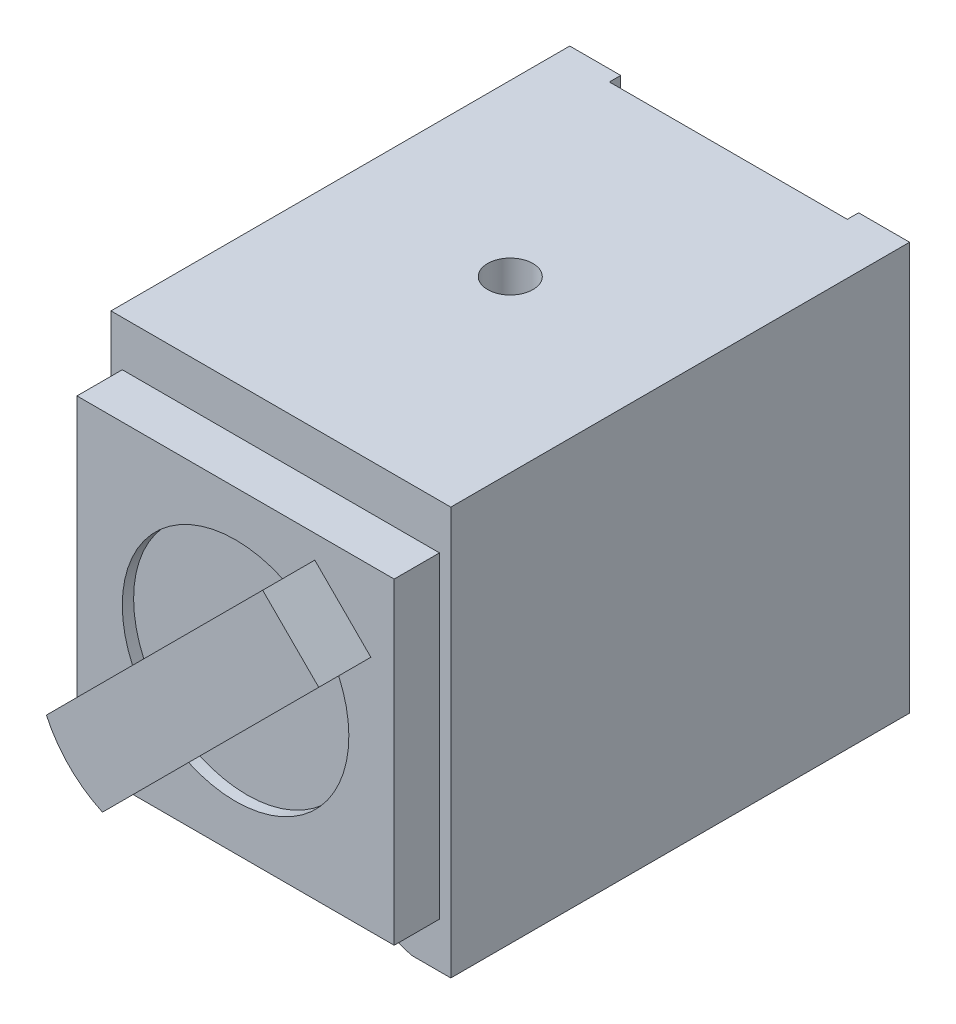
ISO-10303-21;
HEADER;
FILE_DESCRIPTION(('STEP AP214'),'2;1');
FILE_NAME('part.step','',(''),(''),'','','');
FILE_SCHEMA(('AUTOMOTIVE_DESIGN { 1 0 10303 214 1 1 1 1 }'));
ENDSEC;
DATA;
#1=APPLICATION_CONTEXT('core data for automotive mechanical design processes');
#2=APPLICATION_PROTOCOL_DEFINITION('international standard','automotive_design',2000,#1);
#3=PRODUCT_CONTEXT('',#1,'mechanical');
#4=PRODUCT('Part','Part','',(#3));
#5=PRODUCT_RELATED_PRODUCT_CATEGORY('part','',(#4));
#6=PRODUCT_DEFINITION_FORMATION('','',#4);
#7=PRODUCT_DEFINITION_CONTEXT('part definition',#1,'design');
#8=PRODUCT_DEFINITION('design','',#6,#7);
#9=PRODUCT_DEFINITION_SHAPE('','',#8);
#10=(LENGTH_UNIT() NAMED_UNIT(*) SI_UNIT(.MILLI.,.METRE.));
#11=(NAMED_UNIT(*) PLANE_ANGLE_UNIT() SI_UNIT($,.RADIAN.));
#12=(NAMED_UNIT(*) SI_UNIT($,.STERADIAN.) SOLID_ANGLE_UNIT());
#13=UNCERTAINTY_MEASURE_WITH_UNIT(LENGTH_MEASURE(1.E-05),#10,'distance_accuracy_value','');
#14=(GEOMETRIC_REPRESENTATION_CONTEXT(3) GLOBAL_UNCERTAINTY_ASSIGNED_CONTEXT((#13)) GLOBAL_UNIT_ASSIGNED_CONTEXT((#10,
#11,#12)) REPRESENTATION_CONTEXT('',''));
#15=CARTESIAN_POINT('',(0.,0.,0.));
#16=DIRECTION('',(0.,0.,1.));
#17=DIRECTION('',(1.,0.,0.));
#18=AXIS2_PLACEMENT_3D('',#15,#16,#17);
#19=CARTESIAN_POINT('',(0.,0.,0.));
#20=DIRECTION('',(0.,1.,0.));
#21=DIRECTION('',(0.,0.,1.));
#22=AXIS2_PLACEMENT_3D('',#19,#20,#21);
#23=PLANE('',#22);
#24=DIRECTION('',(-1.,0.,0.));
#25=VECTOR('',#24,1.);
#26=CARTESIAN_POINT('',(-15.,0.,-20.25));
#27=LINE('',#26,#25);
#28=CARTESIAN_POINT('',(-11.5,0.,-20.25));
#29=VERTEX_POINT('',#28);
#30=CARTESIAN_POINT('',(-15.,0.,-20.25));
#31=VERTEX_POINT('',#30);
#32=EDGE_CURVE('E232',#29,#31,#27,.T.);
#33=ORIENTED_EDGE('',*,*,#32,.F.);
#34=DIRECTION('',(0.,0.,1.));
#35=VECTOR('',#34,1.);
#36=CARTESIAN_POINT('',(-11.5,0.,-20.25));
#37=LINE('',#36,#35);
#38=CARTESIAN_POINT('',(-11.5,0.,20.25));
#39=VERTEX_POINT('',#38);
#40=EDGE_CURVE('E268',#29,#39,#37,.T.);
#41=ORIENTED_EDGE('',*,*,#40,.T.);
#42=DIRECTION('',(1.,0.,0.));
#43=VECTOR('',#42,1.);
#44=CARTESIAN_POINT('',(-15.,0.,20.25));
#45=LINE('',#44,#43);
#46=CARTESIAN_POINT('',(-15.,0.,20.25));
#47=VERTEX_POINT('',#46);
#48=EDGE_CURVE('E392',#47,#39,#45,.T.);
#49=ORIENTED_EDGE('',*,*,#48,.F.);
#50=DIRECTION('',(0.,0.,1.));
#51=VECTOR('',#50,1.);
#52=CARTESIAN_POINT('',(-15.,0.,-20.25));
#53=LINE('',#52,#51);
#54=EDGE_CURVE('E383',#31,#47,#53,.T.);
#55=ORIENTED_EDGE('',*,*,#54,.F.);
#56=EDGE_LOOP('',(#33,#41,#49,#55));
#57=FACE_BOUND('',#56,.T.);
#58=ADVANCED_FACE('F45',(#57),#23,.F.);
#59=CARTESIAN_POINT('',(-15.,36.,-20.25));
#60=DIRECTION('',(0.,0.,1.));
#61=DIRECTION('',(1.,0.,0.));
#62=AXIS2_PLACEMENT_3D('',#59,#60,#61);
#63=PLANE('',#62);
#64=DIRECTION('',(0.,1.,0.));
#65=VECTOR('',#64,1.);
#66=CARTESIAN_POINT('',(-10.5,0.,-20.25));
#67=LINE('',#66,#65);
#68=CARTESIAN_POINT('',(-10.5,0.352941176470589,-20.25));
#69=VERTEX_POINT('',#68);
#70=CARTESIAN_POINT('',(-10.5,36.,-20.25));
#71=VERTEX_POINT('',#70);
#72=EDGE_CURVE('E289',#69,#71,#67,.T.);
#73=ORIENTED_EDGE('',*,*,#72,.F.);
#74=DIRECTION('',(-0.942990333582889,-0.332820117735137,0.));
#75=VECTOR('',#74,1.);
#76=CARTESIAN_POINT('',(-11.5,0.,-20.25));
#77=LINE('',#76,#75);
#78=EDGE_CURVE('E215',#69,#29,#77,.T.);
#79=ORIENTED_EDGE('',*,*,#78,.T.);
#80=ORIENTED_EDGE('',*,*,#32,.T.);
#81=DIRECTION('',(0.,-1.,0.));
#82=VECTOR('',#81,1.);
#83=CARTESIAN_POINT('',(-15.,36.,-20.25));
#84=LINE('',#83,#82);
#85=CARTESIAN_POINT('',(-15.,36.,-20.25));
#86=VERTEX_POINT('',#85);
#87=EDGE_CURVE('E241',#86,#31,#84,.T.);
#88=ORIENTED_EDGE('',*,*,#87,.F.);
#89=DIRECTION('',(-1.,0.,0.));
#90=VECTOR('',#89,1.);
#91=CARTESIAN_POINT('',(-15.,36.,-20.25));
#92=LINE('',#91,#90);
#93=EDGE_CURVE('E388',#71,#86,#92,.T.);
#94=ORIENTED_EDGE('',*,*,#93,.F.);
#95=EDGE_LOOP('',(#73,#79,#80,#88,#94));
#96=FACE_BOUND('',#95,.T.);
#97=ADVANCED_FACE('F417',(#96),#63,.F.);
#98=CARTESIAN_POINT('',(0.,18.,23.25));
#99=DIRECTION('',(0.,0.,1.));
#100=DIRECTION('',(1.,0.,0.));
#101=AXIS2_PLACEMENT_3D('',#98,#99,#100);
#102=CYLINDRICAL_SURFACE('',#101,10.);
#103=DIRECTION('',(0.,0.,-1.));
#104=VECTOR('',#103,1.);
#105=CARTESIAN_POINT('',(4.14894691559295,27.0986943838988,27.25));
#106=LINE('',#105,#104);
#107=CARTESIAN_POINT('',(4.14894691559295,27.0986943838988,24.25));
#108=VERTEX_POINT('',#107);
#109=CARTESIAN_POINT('',(4.14894691559295,27.0986943838988,23.25));
#110=VERTEX_POINT('',#109);
#111=EDGE_CURVE('E336',#108,#110,#106,.T.);
#112=ORIENTED_EDGE('',*,*,#111,.F.);
#113=CARTESIAN_POINT('',(0.,18.,24.25));
#114=DIRECTION('',(0.,0.,1.));
#115=DIRECTION('',(1.,0.,0.));
#116=AXIS2_PLACEMENT_3D('',#113,#114,#115);
#117=CIRCLE('',#116,10.);
#118=CARTESIAN_POINT('',(-9.0986943838988,13.851053084407,24.25));
#119=VERTEX_POINT('',#118);
#120=EDGE_CURVE('E350',#108,#119,#117,.T.);
#121=ORIENTED_EDGE('',*,*,#120,.T.);
#122=DIRECTION('',(0.,0.,-1.));
#123=VECTOR('',#122,1.);
#124=CARTESIAN_POINT('',(-9.0986943838988,13.851053084407,27.25));
#125=LINE('',#124,#123);
#126=CARTESIAN_POINT('',(-9.0986943838988,13.851053084407,23.25));
#127=VERTEX_POINT('',#126);
#128=EDGE_CURVE('E332',#119,#127,#125,.T.);
#129=ORIENTED_EDGE('',*,*,#128,.T.);
#130=CARTESIAN_POINT('',(0.,18.,23.25));
#131=DIRECTION('',(0.,0.,1.));
#132=DIRECTION('',(1.,0.,0.));
#133=AXIS2_PLACEMENT_3D('',#130,#131,#132);
#134=CIRCLE('',#133,10.);
#135=EDGE_CURVE('E347',#110,#127,#134,.T.);
#136=ORIENTED_EDGE('',*,*,#135,.F.);
#137=EDGE_LOOP('',(#112,#121,#129,#136));
#138=FACE_BOUND('',#137,.T.);
#139=ADVANCED_FACE('F451',(#138),#102,.F.);
#140=DIRECTION('',(0.,0.,-1.));
#141=VECTOR('',#140,1.);
#142=CARTESIAN_POINT('',(-4.14894691559296,8.90130561610119,27.25));
#143=LINE('',#142,#141);
#144=CARTESIAN_POINT('',(-4.14894691559296,8.90130561610119,24.25));
#145=VERTEX_POINT('',#144);
#146=CARTESIAN_POINT('',(-4.14894691559295,8.90130561610118,23.25));
#147=VERTEX_POINT('',#146);
#148=EDGE_CURVE('E68',#145,#147,#143,.T.);
#149=ORIENTED_EDGE('',*,*,#148,.F.);
#150=CARTESIAN_POINT('',(9.0986943838988,22.148946915593,24.25));
#151=VERTEX_POINT('',#150);
#152=EDGE_CURVE('E343',#145,#151,#117,.T.);
#153=ORIENTED_EDGE('',*,*,#152,.T.);
#154=DIRECTION('',(0.,0.,-1.));
#155=VECTOR('',#154,1.);
#156=CARTESIAN_POINT('',(9.0986943838988,22.148946915593,27.25));
#157=LINE('',#156,#155);
#158=CARTESIAN_POINT('',(9.0986943838988,22.148946915593,23.25));
#159=VERTEX_POINT('',#158);
#160=EDGE_CURVE('E323',#151,#159,#157,.T.);
#161=ORIENTED_EDGE('',*,*,#160,.T.);
#162=EDGE_CURVE('E344',#147,#159,#134,.T.);
#163=ORIENTED_EDGE('',*,*,#162,.F.);
#164=EDGE_LOOP('',(#149,#153,#161,#163));
#165=FACE_BOUND('',#164,.T.);
#166=ADVANCED_FACE('F467',(#165),#102,.F.);
#167=CARTESIAN_POINT('',(0.,18.,23.25));
#168=DIRECTION('',(0.,0.,1.));
#169=DIRECTION('',(1.,0.,0.));
#170=AXIS2_PLACEMENT_3D('',#167,#168,#169);
#171=PLANE('',#170);
#172=ORIENTED_EDGE('',*,*,#135,.T.);
#173=DIRECTION('',(-0.707106781186546,-0.707106781186549,0.));
#174=VECTOR('',#173,1.);
#175=CARTESIAN_POINT('',(4.14894691559295,27.0986943838988,23.25));
#176=LINE('',#175,#174);
#177=EDGE_CURVE('E319',#110,#127,#176,.T.);
#178=ORIENTED_EDGE('',*,*,#177,.F.);
#179=EDGE_LOOP('',(#172,#178));
#180=FACE_BOUND('',#179,.T.);
#181=ADVANCED_FACE('F460',(#180),#171,.T.);
#182=ORIENTED_EDGE('',*,*,#162,.T.);
#183=DIRECTION('',(0.707106781186546,0.707106781186549,0.));
#184=VECTOR('',#183,1.);
#185=CARTESIAN_POINT('',(9.0986943838988,22.148946915593,23.25));
#186=LINE('',#185,#184);
#187=EDGE_CURVE('E324',#147,#159,#186,.T.);
#188=ORIENTED_EDGE('',*,*,#187,.F.);
#189=EDGE_LOOP('',(#182,#188));
#190=FACE_BOUND('',#189,.T.);
#191=ADVANCED_FACE('F455',(#190),#171,.T.);
#192=CARTESIAN_POINT('',(-15.,36.,20.25));
#193=DIRECTION('',(0.,0.,-1.));
#194=DIRECTION('',(-1.,0.,0.));
#195=AXIS2_PLACEMENT_3D('',#192,#193,#194);
#196=PLANE('',#195);
#197=ORIENTED_EDGE('',*,*,#48,.T.);
#198=DIRECTION('',(-0.942990333582889,-0.332820117735137,0.));
#199=VECTOR('',#198,1.);
#200=CARTESIAN_POINT('',(-11.5,0.,20.25));
#201=LINE('',#200,#199);
#202=CARTESIAN_POINT('',(-3.,3.,20.25));
#203=VERTEX_POINT('',#202);
#204=EDGE_CURVE('E216',#203,#39,#201,.T.);
#205=ORIENTED_EDGE('',*,*,#204,.F.);
#206=DIRECTION('',(-1.,0.,0.));
#207=VECTOR('',#206,1.);
#208=CARTESIAN_POINT('',(-3.,3.,20.25));
#209=LINE('',#208,#207);
#210=CARTESIAN_POINT('',(3.,3.,20.25));
#211=VERTEX_POINT('',#210);
#212=EDGE_CURVE('E265',#211,#203,#209,.T.);
#213=ORIENTED_EDGE('',*,*,#212,.F.);
#214=DIRECTION('',(-0.942990333582889,0.332820117735137,0.));
#215=VECTOR('',#214,1.);
#216=CARTESIAN_POINT('',(11.5,0.,20.25));
#217=LINE('',#216,#215);
#218=CARTESIAN_POINT('',(11.5,0.,20.25));
#219=VERTEX_POINT('',#218);
#220=EDGE_CURVE('E399',#219,#211,#217,.T.);
#221=ORIENTED_EDGE('',*,*,#220,.F.);
#222=CARTESIAN_POINT('',(15.,0.,20.25));
#223=VERTEX_POINT('',#222);
#224=EDGE_CURVE('E224',#219,#223,#45,.T.);
#225=ORIENTED_EDGE('',*,*,#224,.T.);
#226=DIRECTION('',(0.,-1.,0.));
#227=VECTOR('',#226,1.);
#228=CARTESIAN_POINT('',(15.,36.,20.25));
#229=LINE('',#228,#227);
#230=CARTESIAN_POINT('',(15.,36.,20.25));
#231=VERTEX_POINT('',#230);
#232=EDGE_CURVE('E246',#231,#223,#229,.T.);
#233=ORIENTED_EDGE('',*,*,#232,.F.);
#234=DIRECTION('',(1.,0.,0.));
#235=VECTOR('',#234,1.);
#236=CARTESIAN_POINT('',(-15.,36.,20.25));
#237=LINE('',#236,#235);
#238=CARTESIAN_POINT('',(-15.,36.,20.25));
#239=VERTEX_POINT('',#238);
#240=EDGE_CURVE('E235',#239,#231,#237,.T.);
#241=ORIENTED_EDGE('',*,*,#240,.F.);
#242=DIRECTION('',(0.,-1.,0.));
#243=VECTOR('',#242,1.);
#244=CARTESIAN_POINT('',(-15.,36.,20.25));
#245=LINE('',#244,#243);
#246=EDGE_CURVE('E249',#239,#47,#245,.T.);
#247=ORIENTED_EDGE('',*,*,#246,.T.);
#248=EDGE_LOOP('',(#197,#205,#213,#221,#225,#233,#241,#247));
#249=FACE_BOUND('',#248,.T.);
#250=DIRECTION('',(0.,-1.,0.));
#251=VECTOR('',#250,1.);
#252=CARTESIAN_POINT('',(-14.,32.,20.25));
#253=LINE('',#252,#251);
#254=CARTESIAN_POINT('',(-14.,32.,20.25));
#255=VERTEX_POINT('',#254);
#256=CARTESIAN_POINT('',(-14.,4.,20.25));
#257=VERTEX_POINT('',#256);
#258=EDGE_CURVE('E362',#255,#257,#253,.T.);
#259=ORIENTED_EDGE('',*,*,#258,.F.);
#260=DIRECTION('',(-1.,0.,0.));
#261=VECTOR('',#260,1.);
#262=CARTESIAN_POINT('',(-14.,32.,20.25));
#263=LINE('',#262,#261);
#264=CARTESIAN_POINT('',(14.,32.,20.25));
#265=VERTEX_POINT('',#264);
#266=EDGE_CURVE('E355',#265,#255,#263,.T.);
#267=ORIENTED_EDGE('',*,*,#266,.F.);
#268=DIRECTION('',(0.,1.,0.));
#269=VECTOR('',#268,1.);
#270=CARTESIAN_POINT('',(14.,32.,20.25));
#271=LINE('',#270,#269);
#272=CARTESIAN_POINT('',(14.,3.99999999999999,20.25));
#273=VERTEX_POINT('',#272);
#274=EDGE_CURVE('E368',#273,#265,#271,.T.);
#275=ORIENTED_EDGE('',*,*,#274,.F.);
#276=DIRECTION('',(1.,0.,0.));
#277=VECTOR('',#276,1.);
#278=CARTESIAN_POINT('',(-14.,4.,20.25));
#279=LINE('',#278,#277);
#280=EDGE_CURVE('E365',#257,#273,#279,.T.);
#281=ORIENTED_EDGE('',*,*,#280,.F.);
#282=EDGE_LOOP('',(#259,#267,#275,#281));
#283=FACE_BOUND('',#282,.T.);
#284=ADVANCED_FACE('F396',(#249,#283),#196,.F.);
#285=CARTESIAN_POINT('',(-15.,36.,-20.25));
#286=DIRECTION('',(1.,0.,0.));
#287=DIRECTION('',(0.,0.,-1.));
#288=AXIS2_PLACEMENT_3D('',#285,#286,#287);
#289=PLANE('',#288);
#290=ORIENTED_EDGE('',*,*,#54,.T.);
#291=ORIENTED_EDGE('',*,*,#246,.F.);
#292=DIRECTION('',(0.,0.,1.));
#293=VECTOR('',#292,1.);
#294=CARTESIAN_POINT('',(-15.,36.,-20.25));
#295=LINE('',#294,#293);
#296=EDGE_CURVE('E231',#86,#239,#295,.T.);
#297=ORIENTED_EDGE('',*,*,#296,.F.);
#298=ORIENTED_EDGE('',*,*,#87,.T.);
#299=EDGE_LOOP('',(#290,#291,#297,#298));
#300=FACE_BOUND('',#299,.T.);
#301=ADVANCED_FACE('F47',(#300),#289,.F.);
#302=CARTESIAN_POINT('',(15.,36.,-20.25));
#303=DIRECTION('',(-1.,0.,0.));
#304=DIRECTION('',(0.,0.,1.));
#305=AXIS2_PLACEMENT_3D('',#302,#303,#304);
#306=PLANE('',#305);
#307=DIRECTION('',(0.,0.,-1.));
#308=VECTOR('',#307,1.);
#309=CARTESIAN_POINT('',(15.,0.,-20.25));
#310=LINE('',#309,#308);
#311=CARTESIAN_POINT('',(15.,0.,-20.25));
#312=VERTEX_POINT('',#311);
#313=EDGE_CURVE('E237',#223,#312,#310,.T.);
#314=ORIENTED_EDGE('',*,*,#313,.T.);
#315=DIRECTION('',(0.,-1.,0.));
#316=VECTOR('',#315,1.);
#317=CARTESIAN_POINT('',(15.,36.,-20.25));
#318=LINE('',#317,#316);
#319=CARTESIAN_POINT('',(15.,36.,-20.25));
#320=VERTEX_POINT('',#319);
#321=EDGE_CURVE('E230',#320,#312,#318,.T.);
#322=ORIENTED_EDGE('',*,*,#321,.F.);
#323=DIRECTION('',(0.,0.,-1.));
#324=VECTOR('',#323,1.);
#325=CARTESIAN_POINT('',(15.,36.,-20.25));
#326=LINE('',#325,#324);
#327=EDGE_CURVE('E386',#231,#320,#326,.T.);
#328=ORIENTED_EDGE('',*,*,#327,.F.);
#329=ORIENTED_EDGE('',*,*,#232,.T.);
#330=EDGE_LOOP('',(#314,#322,#328,#329));
#331=FACE_BOUND('',#330,.T.);
#332=ADVANCED_FACE('F401',(#331),#306,.F.);
#333=CARTESIAN_POINT('',(11.5,0.,-20.25));
#334=VERTEX_POINT('',#333);
#335=EDGE_CURVE('E223',#312,#334,#27,.T.);
#336=ORIENTED_EDGE('',*,*,#335,.T.);
#337=DIRECTION('',(-0.942990333582889,0.332820117735137,0.));
#338=VECTOR('',#337,1.);
#339=CARTESIAN_POINT('',(11.5,0.,-20.25));
#340=LINE('',#339,#338);
#341=CARTESIAN_POINT('',(10.5,0.352941176470589,-20.25));
#342=VERTEX_POINT('',#341);
#343=EDGE_CURVE('E205',#334,#342,#340,.T.);
#344=ORIENTED_EDGE('',*,*,#343,.T.);
#345=DIRECTION('',(0.,1.,0.));
#346=VECTOR('',#345,1.);
#347=CARTESIAN_POINT('',(10.5,0.,-20.25));
#348=LINE('',#347,#346);
#349=CARTESIAN_POINT('',(10.5,36.,-20.25));
#350=VERTEX_POINT('',#349);
#351=EDGE_CURVE('E292',#342,#350,#348,.T.);
#352=ORIENTED_EDGE('',*,*,#351,.T.);
#353=EDGE_CURVE('E244',#320,#350,#92,.T.);
#354=ORIENTED_EDGE('',*,*,#353,.F.);
#355=ORIENTED_EDGE('',*,*,#321,.T.);
#356=EDGE_LOOP('',(#336,#344,#352,#354,#355));
#357=FACE_BOUND('',#356,.T.);
#358=ADVANCED_FACE('F227',(#357),#63,.F.);
#359=CARTESIAN_POINT('',(0.,36.,0.));
#360=DIRECTION('',(0.,1.,0.));
#361=DIRECTION('',(0.,0.,1.));
#362=AXIS2_PLACEMENT_3D('',#359,#360,#361);
#363=PLANE('',#362);
#364=CARTESIAN_POINT('',(0.,36.,0.));
#365=DIRECTION('',(0.,1.,0.));
#366=DIRECTION('',(0.,0.,1.));
#367=AXIS2_PLACEMENT_3D('',#364,#365,#366);
#368=CIRCLE('',#367,2.);
#369=CARTESIAN_POINT('',(0.,36.,2.));
#370=VERTEX_POINT('',#369);
#371=EDGE_CURVE('E425',#370,#370,#368,.T.);
#372=ORIENTED_EDGE('',*,*,#371,.F.);
#373=EDGE_LOOP('',(#372));
#374=FACE_BOUND('',#373,.T.);
#375=DIRECTION('',(0.,0.,1.));
#376=VECTOR('',#375,1.);
#377=CARTESIAN_POINT('',(-10.5,36.,-20.25));
#378=LINE('',#377,#376);
#379=CARTESIAN_POINT('',(-10.5,36.,-19.25));
#380=VERTEX_POINT('',#379);
#381=EDGE_CURVE('E279',#71,#380,#378,.T.);
#382=ORIENTED_EDGE('',*,*,#381,.F.);
#383=ORIENTED_EDGE('',*,*,#93,.T.);
#384=ORIENTED_EDGE('',*,*,#296,.T.);
#385=ORIENTED_EDGE('',*,*,#240,.T.);
#386=ORIENTED_EDGE('',*,*,#327,.T.);
#387=ORIENTED_EDGE('',*,*,#353,.T.);
#388=DIRECTION('',(0.,0.,-1.));
#389=VECTOR('',#388,1.);
#390=CARTESIAN_POINT('',(10.5,36.,-20.25));
#391=LINE('',#390,#389);
#392=CARTESIAN_POINT('',(10.5,36.,-19.25));
#393=VERTEX_POINT('',#392);
#394=EDGE_CURVE('E285',#393,#350,#391,.T.);
#395=ORIENTED_EDGE('',*,*,#394,.F.);
#396=DIRECTION('',(1.,0.,0.));
#397=VECTOR('',#396,1.);
#398=CARTESIAN_POINT('',(-10.5,36.,-19.25));
#399=LINE('',#398,#397);
#400=EDGE_CURVE('E282',#380,#393,#399,.T.);
#401=ORIENTED_EDGE('',*,*,#400,.F.);
#402=EDGE_LOOP('',(#382,#383,#384,#385,#386,#387,#395,#401));
#403=FACE_BOUND('',#402,.T.);
#404=ADVANCED_FACE('F404',(#374,#403),#363,.T.);
#405=ORIENTED_EDGE('',*,*,#224,.F.);
#406=DIRECTION('',(0.,0.,1.));
#407=VECTOR('',#406,1.);
#408=CARTESIAN_POINT('',(11.5,0.,-20.25));
#409=LINE('',#408,#407);
#410=EDGE_CURVE('E208',#334,#219,#409,.T.);
#411=ORIENTED_EDGE('',*,*,#410,.F.);
#412=ORIENTED_EDGE('',*,*,#335,.F.);
#413=ORIENTED_EDGE('',*,*,#313,.F.);
#414=EDGE_LOOP('',(#405,#411,#412,#413));
#415=FACE_BOUND('',#414,.T.);
#416=ADVANCED_FACE('F221',(#415),#23,.F.);
#417=CARTESIAN_POINT('',(-14.,32.,24.25));
#418=DIRECTION('',(1.,0.,0.));
#419=DIRECTION('',(0.,0.,-1.));
#420=AXIS2_PLACEMENT_3D('',#417,#418,#419);
#421=PLANE('',#420);
#422=ORIENTED_EDGE('',*,*,#258,.T.);
#423=DIRECTION('',(0.,0.,-1.));
#424=VECTOR('',#423,1.);
#425=CARTESIAN_POINT('',(-14.,4.,24.25));
#426=LINE('',#425,#424);
#427=CARTESIAN_POINT('',(-14.,4.,24.25));
#428=VERTEX_POINT('',#427);
#429=EDGE_CURVE('E381',#428,#257,#426,.T.);
#430=ORIENTED_EDGE('',*,*,#429,.F.);
#431=DIRECTION('',(0.,-1.,0.));
#432=VECTOR('',#431,1.);
#433=CARTESIAN_POINT('',(-14.,32.,24.25));
#434=LINE('',#433,#432);
#435=CARTESIAN_POINT('',(-14.,32.,24.25));
#436=VERTEX_POINT('',#435);
#437=EDGE_CURVE('E351',#436,#428,#434,.T.);
#438=ORIENTED_EDGE('',*,*,#437,.F.);
#439=DIRECTION('',(0.,0.,-1.));
#440=VECTOR('',#439,1.);
#441=CARTESIAN_POINT('',(-14.,32.,24.25));
#442=LINE('',#441,#440);
#443=EDGE_CURVE('E361',#436,#255,#442,.T.);
#444=ORIENTED_EDGE('',*,*,#443,.T.);
#445=EDGE_LOOP('',(#422,#430,#438,#444));
#446=FACE_BOUND('',#445,.T.);
#447=ADVANCED_FACE('F441',(#446),#421,.F.);
#448=CARTESIAN_POINT('',(-14.,4.,24.25));
#449=DIRECTION('',(0.,1.,0.));
#450=DIRECTION('',(-1.,0.,0.));
#451=AXIS2_PLACEMENT_3D('',#448,#449,#450);
#452=PLANE('',#451);
#453=ORIENTED_EDGE('',*,*,#280,.T.);
#454=DIRECTION('',(0.,0.,-1.));
#455=VECTOR('',#454,1.);
#456=CARTESIAN_POINT('',(14.,3.99999999999999,24.25));
#457=LINE('',#456,#455);
#458=CARTESIAN_POINT('',(14.,3.99999999999999,24.25));
#459=VERTEX_POINT('',#458);
#460=EDGE_CURVE('E378',#459,#273,#457,.T.);
#461=ORIENTED_EDGE('',*,*,#460,.F.);
#462=DIRECTION('',(1.,0.,0.));
#463=VECTOR('',#462,1.);
#464=CARTESIAN_POINT('',(-14.,4.,24.25));
#465=LINE('',#464,#463);
#466=EDGE_CURVE('E354',#428,#459,#465,.T.);
#467=ORIENTED_EDGE('',*,*,#466,.F.);
#468=ORIENTED_EDGE('',*,*,#429,.T.);
#469=EDGE_LOOP('',(#453,#461,#467,#468));
#470=FACE_BOUND('',#469,.T.);
#471=ADVANCED_FACE('F487',(#470),#452,.F.);
#472=CARTESIAN_POINT('',(14.,32.,24.25));
#473=DIRECTION('',(-1.,0.,0.));
#474=DIRECTION('',(0.,0.,1.));
#475=AXIS2_PLACEMENT_3D('',#472,#473,#474);
#476=PLANE('',#475);
#477=ORIENTED_EDGE('',*,*,#274,.T.);
#478=DIRECTION('',(0.,0.,-1.));
#479=VECTOR('',#478,1.);
#480=CARTESIAN_POINT('',(14.,32.,24.25));
#481=LINE('',#480,#479);
#482=CARTESIAN_POINT('',(14.,32.,24.25));
#483=VERTEX_POINT('',#482);
#484=EDGE_CURVE('E375',#483,#265,#481,.T.);
#485=ORIENTED_EDGE('',*,*,#484,.F.);
#486=DIRECTION('',(0.,1.,0.));
#487=VECTOR('',#486,1.);
#488=CARTESIAN_POINT('',(14.,32.,24.25));
#489=LINE('',#488,#487);
#490=EDGE_CURVE('E357',#459,#483,#489,.T.);
#491=ORIENTED_EDGE('',*,*,#490,.F.);
#492=ORIENTED_EDGE('',*,*,#460,.T.);
#493=EDGE_LOOP('',(#477,#485,#491,#492));
#494=FACE_BOUND('',#493,.T.);
#495=ADVANCED_FACE('F483',(#494),#476,.F.);
#496=CARTESIAN_POINT('',(-14.,32.,24.25));
#497=DIRECTION('',(0.,-1.,0.));
#498=DIRECTION('',(0.,0.,-1.));
#499=AXIS2_PLACEMENT_3D('',#496,#497,#498);
#500=PLANE('',#499);
#501=ORIENTED_EDGE('',*,*,#266,.T.);
#502=ORIENTED_EDGE('',*,*,#443,.F.);
#503=DIRECTION('',(-1.,0.,0.));
#504=VECTOR('',#503,1.);
#505=CARTESIAN_POINT('',(-14.,32.,24.25));
#506=LINE('',#505,#504);
#507=EDGE_CURVE('E359',#483,#436,#506,.T.);
#508=ORIENTED_EDGE('',*,*,#507,.F.);
#509=ORIENTED_EDGE('',*,*,#484,.T.);
#510=EDGE_LOOP('',(#501,#502,#508,#509));
#511=FACE_BOUND('',#510,.T.);
#512=ADVANCED_FACE('F479',(#511),#500,.F.);
#513=CARTESIAN_POINT('',(0.,0.,24.25));
#514=DIRECTION('',(0.,0.,1.));
#515=DIRECTION('',(1.,0.,0.));
#516=AXIS2_PLACEMENT_3D('',#513,#514,#515);
#517=PLANE('',#516);
#518=EDGE_CURVE('E348',#151,#108,#117,.T.);
#519=ORIENTED_EDGE('',*,*,#518,.F.);
#520=ORIENTED_EDGE('',*,*,#152,.F.);
#521=CARTESIAN_POINT('',(0.,18.,24.25));
#522=DIRECTION('',(0.,0.,1.));
#523=DIRECTION('',(1.,0.,0.));
#524=AXIS2_PLACEMENT_3D('',#521,#522,#523);
#525=CIRCLE('',#524,10.);
#526=EDGE_CURVE('E340',#145,#119,#525,.F.);
#527=ORIENTED_EDGE('',*,*,#526,.T.);
#528=ORIENTED_EDGE('',*,*,#120,.F.);
#529=EDGE_LOOP('',(#519,#520,#527,#528));
#530=FACE_BOUND('',#529,.T.);
#531=ORIENTED_EDGE('',*,*,#437,.T.);
#532=ORIENTED_EDGE('',*,*,#466,.T.);
#533=ORIENTED_EDGE('',*,*,#490,.T.);
#534=ORIENTED_EDGE('',*,*,#507,.T.);
#535=EDGE_LOOP('',(#531,#532,#533,#534));
#536=FACE_BOUND('',#535,.T.);
#537=ADVANCED_FACE('F476',(#530,#536),#517,.T.);
#538=CARTESIAN_POINT('',(0.,18.,27.25));
#539=DIRECTION('',(0.,0.,-1.));
#540=DIRECTION('',(-1.,0.,0.));
#541=AXIS2_PLACEMENT_3D('',#538,#539,#540);
#542=CYLINDRICAL_SURFACE('',#541,10.);
#543=ORIENTED_EDGE('',*,*,#518,.T.);
#544=CARTESIAN_POINT('',(4.14894691559296,27.0986943838988,27.25));
#545=VERTEX_POINT('',#544);
#546=EDGE_CURVE('E337',#545,#108,#106,.T.);
#547=ORIENTED_EDGE('',*,*,#546,.F.);
#548=CARTESIAN_POINT('',(0.,18.,27.25));
#549=DIRECTION('',(0.,0.,1.));
#550=DIRECTION('',(1.,0.,0.));
#551=AXIS2_PLACEMENT_3D('',#548,#549,#550);
#552=CIRCLE('',#551,10.);
#553=CARTESIAN_POINT('',(9.0986943838988,22.148946915593,27.25));
#554=VERTEX_POINT('',#553);
#555=EDGE_CURVE('E320',#554,#545,#552,.T.);
#556=ORIENTED_EDGE('',*,*,#555,.F.);
#557=EDGE_CURVE('E327',#554,#151,#157,.T.);
#558=ORIENTED_EDGE('',*,*,#557,.T.);
#559=EDGE_LOOP('',(#543,#547,#556,#558));
#560=FACE_BOUND('',#559,.T.);
#561=ADVANCED_FACE('F471',(#560),#542,.T.);
#562=CARTESIAN_POINT('',(4.14894691559295,27.0986943838988,27.25));
#563=DIRECTION('',(0.707106781186549,-0.707106781186546,0.));
#564=DIRECTION('',(0.707106781186546,0.707106781186549,0.));
#565=AXIS2_PLACEMENT_3D('',#562,#563,#564);
#566=PLANE('',#565);
#567=ORIENTED_EDGE('',*,*,#177,.T.);
#568=ORIENTED_EDGE('',*,*,#128,.F.);
#569=CARTESIAN_POINT('',(-9.0986943838988,13.851053084407,31.85));
#570=VERTEX_POINT('',#569);
#571=EDGE_CURVE('E333',#570,#119,#125,.T.);
#572=ORIENTED_EDGE('',*,*,#571,.F.);
#573=DIRECTION('',(-0.707106781186546,-0.707106781186549,0.));
#574=VECTOR('',#573,1.);
#575=CARTESIAN_POINT('',(-9.0986943838988,13.851053084407,31.85));
#576=LINE('',#575,#574);
#577=CARTESIAN_POINT('',(9.99318870813797,32.9429361764438,31.85));
#578=VERTEX_POINT('',#577);
#579=EDGE_CURVE('E305',#578,#570,#576,.T.);
#580=ORIENTED_EDGE('',*,*,#579,.F.);
#581=DIRECTION('',(0.,0.,-1.));
#582=VECTOR('',#581,1.);
#583=CARTESIAN_POINT('',(9.99318870813797,32.9429361764438,31.85));
#584=LINE('',#583,#582);
#585=CARTESIAN_POINT('',(9.99318870813797,32.9429361764438,27.25));
#586=VERTEX_POINT('',#585);
#587=EDGE_CURVE('E308',#578,#586,#584,.T.);
#588=ORIENTED_EDGE('',*,*,#587,.T.);
#589=DIRECTION('',(-0.707106781186546,-0.707106781186549,0.));
#590=VECTOR('',#589,1.);
#591=CARTESIAN_POINT('',(-9.0986943838988,13.851053084407,27.25));
#592=LINE('',#591,#590);
#593=EDGE_CURVE('E301',#586,#545,#592,.T.);
#594=ORIENTED_EDGE('',*,*,#593,.T.);
#595=ORIENTED_EDGE('',*,*,#546,.T.);
#596=ORIENTED_EDGE('',*,*,#111,.T.);
#597=EDGE_LOOP('',(#567,#568,#572,#580,#588,#594,#595,#596));
#598=FACE_BOUND('',#597,.T.);
#599=ADVANCED_FACE('F548',(#598),#566,.F.);
#600=CARTESIAN_POINT('',(0.,18.,27.25));
#601=DIRECTION('',(0.,0.,-1.));
#602=DIRECTION('',(-1.,0.,0.));
#603=AXIS2_PLACEMENT_3D('',#600,#601,#602);
#604=CYLINDRICAL_SURFACE('',#603,10.);
#605=ORIENTED_EDGE('',*,*,#526,.F.);
#606=CARTESIAN_POINT('',(-4.14894691559296,8.90130561610119,31.85));
#607=VERTEX_POINT('',#606);
#608=EDGE_CURVE('E330',#607,#145,#143,.T.);
#609=ORIENTED_EDGE('',*,*,#608,.F.);
#610=CARTESIAN_POINT('',(0.,18.,31.85));
#611=DIRECTION('',(0.,0.,1.));
#612=DIRECTION('',(1.,0.,0.));
#613=AXIS2_PLACEMENT_3D('',#610,#611,#612);
#614=CIRCLE('',#613,10.);
#615=EDGE_CURVE('E297',#570,#607,#614,.T.);
#616=ORIENTED_EDGE('',*,*,#615,.F.);
#617=ORIENTED_EDGE('',*,*,#571,.T.);
#618=EDGE_LOOP('',(#605,#609,#616,#617));
#619=FACE_BOUND('',#618,.T.);
#620=ADVANCED_FACE('F558',(#619),#604,.T.);
#621=CARTESIAN_POINT('',(9.0986943838988,22.148946915593,27.25));
#622=DIRECTION('',(-0.707106781186549,0.707106781186546,0.));
#623=DIRECTION('',(-0.707106781186546,-0.707106781186549,0.));
#624=AXIS2_PLACEMENT_3D('',#621,#622,#623);
#625=PLANE('',#624);
#626=ORIENTED_EDGE('',*,*,#187,.T.);
#627=ORIENTED_EDGE('',*,*,#160,.F.);
#628=ORIENTED_EDGE('',*,*,#557,.F.);
#629=DIRECTION('',(0.707106781186548,0.707106781186547,0.));
#630=VECTOR('',#629,1.);
#631=CARTESIAN_POINT('',(-4.14894691559296,8.90130561610119,27.25));
#632=LINE('',#631,#630);
#633=CARTESIAN_POINT('',(14.9429361764438,27.993188708138,27.25));
#634=VERTEX_POINT('',#633);
#635=EDGE_CURVE('E291',#554,#634,#632,.T.);
#636=ORIENTED_EDGE('',*,*,#635,.T.);
#637=DIRECTION('',(0.,0.,-1.));
#638=VECTOR('',#637,1.);
#639=CARTESIAN_POINT('',(14.9429361764438,27.993188708138,31.85));
#640=LINE('',#639,#638);
#641=CARTESIAN_POINT('',(14.9429361764438,27.993188708138,31.85));
#642=VERTEX_POINT('',#641);
#643=EDGE_CURVE('E316',#642,#634,#640,.T.);
#644=ORIENTED_EDGE('',*,*,#643,.F.);
#645=DIRECTION('',(0.707106781186548,0.707106781186547,0.));
#646=VECTOR('',#645,1.);
#647=CARTESIAN_POINT('',(-4.14894691559296,8.90130561610119,31.85));
#648=LINE('',#647,#646);
#649=EDGE_CURVE('E300',#607,#642,#648,.T.);
#650=ORIENTED_EDGE('',*,*,#649,.F.);
#651=ORIENTED_EDGE('',*,*,#608,.T.);
#652=ORIENTED_EDGE('',*,*,#148,.T.);
#653=EDGE_LOOP('',(#626,#627,#628,#636,#644,#650,#651,#652));
#654=FACE_BOUND('',#653,.T.);
#655=ADVANCED_FACE('F571',(#654),#625,.F.);
#656=CARTESIAN_POINT('',(9.99318870813797,32.9429361764438,31.85));
#657=DIRECTION('',(-0.707106781186548,-0.707106781186548,0.));
#658=DIRECTION('',(0.707106781186548,-0.707106781186548,0.));
#659=AXIS2_PLACEMENT_3D('',#656,#657,#658);
#660=PLANE('',#659);
#661=DIRECTION('',(-0.707106781186548,0.707106781186548,0.));
#662=VECTOR('',#661,1.);
#663=CARTESIAN_POINT('',(9.99318870813797,32.9429361764438,27.25));
#664=LINE('',#663,#662);
#665=EDGE_CURVE('E310',#634,#586,#664,.T.);
#666=ORIENTED_EDGE('',*,*,#665,.T.);
#667=ORIENTED_EDGE('',*,*,#587,.F.);
#668=DIRECTION('',(-0.707106781186548,0.707106781186548,0.));
#669=VECTOR('',#668,1.);
#670=CARTESIAN_POINT('',(9.99318870813797,32.9429361764438,31.85));
#671=LINE('',#670,#669);
#672=EDGE_CURVE('E303',#642,#578,#671,.T.);
#673=ORIENTED_EDGE('',*,*,#672,.F.);
#674=ORIENTED_EDGE('',*,*,#643,.T.);
#675=EDGE_LOOP('',(#666,#667,#673,#674));
#676=FACE_BOUND('',#675,.T.);
#677=ADVANCED_FACE('F585',(#676),#660,.F.);
#678=CARTESIAN_POINT('',(0.,18.,31.85));
#679=DIRECTION('',(0.,0.,1.));
#680=DIRECTION('',(1.,0.,0.));
#681=AXIS2_PLACEMENT_3D('',#678,#679,#680);
#682=PLANE('',#681);
#683=ORIENTED_EDGE('',*,*,#615,.T.);
#684=ORIENTED_EDGE('',*,*,#649,.T.);
#685=ORIENTED_EDGE('',*,*,#672,.T.);
#686=ORIENTED_EDGE('',*,*,#579,.T.);
#687=EDGE_LOOP('',(#683,#684,#685,#686));
#688=FACE_BOUND('',#687,.T.);
#689=ADVANCED_FACE('F595',(#688),#682,.T.);
#690=CARTESIAN_POINT('',(0.,18.,27.25));
#691=DIRECTION('',(0.,0.,1.));
#692=DIRECTION('',(1.,0.,0.));
#693=AXIS2_PLACEMENT_3D('',#690,#691,#692);
#694=PLANE('',#693);
#695=ORIENTED_EDGE('',*,*,#635,.F.);
#696=ORIENTED_EDGE('',*,*,#555,.T.);
#697=ORIENTED_EDGE('',*,*,#593,.F.);
#698=ORIENTED_EDGE('',*,*,#665,.F.);
#699=EDGE_LOOP('',(#695,#696,#697,#698));
#700=FACE_BOUND('',#699,.T.);
#701=ADVANCED_FACE('F605',(#700),#694,.F.);
#702=CARTESIAN_POINT('',(-10.5,0.,-20.25));
#703=DIRECTION('',(-1.,0.,0.));
#704=DIRECTION('',(0.,0.,1.));
#705=AXIS2_PLACEMENT_3D('',#702,#703,#704);
#706=PLANE('',#705);
#707=DIRECTION('',(0.,1.,0.));
#708=VECTOR('',#707,1.);
#709=CARTESIAN_POINT('',(-10.5,0.,-19.25));
#710=LINE('',#709,#708);
#711=CARTESIAN_POINT('',(-10.5,0.352941176470587,-19.25));
#712=VERTEX_POINT('',#711);
#713=EDGE_CURVE('E288',#712,#380,#710,.T.);
#714=ORIENTED_EDGE('',*,*,#713,.F.);
#715=DIRECTION('',(0.,0.,-1.));
#716=VECTOR('',#715,1.);
#717=CARTESIAN_POINT('',(-10.5,0.352941176470589,-20.25));
#718=LINE('',#717,#716);
#719=EDGE_CURVE('E276',#712,#69,#718,.T.);
#720=ORIENTED_EDGE('',*,*,#719,.T.);
#721=ORIENTED_EDGE('',*,*,#72,.T.);
#722=ORIENTED_EDGE('',*,*,#381,.T.);
#723=EDGE_LOOP('',(#714,#720,#721,#722));
#724=FACE_BOUND('',#723,.T.);
#725=ADVANCED_FACE('F614',(#724),#706,.F.);
#726=CARTESIAN_POINT('',(10.5,0.,-20.25));
#727=DIRECTION('',(1.,0.,0.));
#728=DIRECTION('',(0.,0.,-1.));
#729=AXIS2_PLACEMENT_3D('',#726,#727,#728);
#730=PLANE('',#729);
#731=ORIENTED_EDGE('',*,*,#351,.F.);
#732=DIRECTION('',(0.,0.,1.));
#733=VECTOR('',#732,1.);
#734=CARTESIAN_POINT('',(10.5,0.352941176470589,-20.25));
#735=LINE('',#734,#733);
#736=CARTESIAN_POINT('',(10.5,0.352941176470588,-19.25));
#737=VERTEX_POINT('',#736);
#738=EDGE_CURVE('E211',#342,#737,#735,.T.);
#739=ORIENTED_EDGE('',*,*,#738,.T.);
#740=DIRECTION('',(0.,1.,0.));
#741=VECTOR('',#740,1.);
#742=CARTESIAN_POINT('',(10.5,0.,-19.25));
#743=LINE('',#742,#741);
#744=EDGE_CURVE('E294',#737,#393,#743,.T.);
#745=ORIENTED_EDGE('',*,*,#744,.T.);
#746=ORIENTED_EDGE('',*,*,#394,.T.);
#747=EDGE_LOOP('',(#731,#739,#745,#746));
#748=FACE_BOUND('',#747,.T.);
#749=ADVANCED_FACE('F628',(#748),#730,.F.);
#750=CARTESIAN_POINT('',(-10.5,0.,-19.25));
#751=DIRECTION('',(0.,0.,1.));
#752=DIRECTION('',(1.,0.,0.));
#753=AXIS2_PLACEMENT_3D('',#750,#751,#752);
#754=PLANE('',#753);
#755=DIRECTION('',(-1.,0.,0.));
#756=VECTOR('',#755,1.);
#757=CARTESIAN_POINT('',(-10.5,3.,-19.25));
#758=LINE('',#757,#756);
#759=CARTESIAN_POINT('',(3.,3.,-19.25));
#760=VERTEX_POINT('',#759);
#761=CARTESIAN_POINT('',(-3.,3.,-19.25));
#762=VERTEX_POINT('',#761);
#763=EDGE_CURVE('E53',#760,#762,#758,.T.);
#764=ORIENTED_EDGE('',*,*,#763,.T.);
#765=DIRECTION('',(-0.94299033358289,-0.332820117735137,0.));
#766=VECTOR('',#765,1.);
#767=CARTESIAN_POINT('',(-10.6107692307692,0.313846153846153,-19.25));
#768=LINE('',#767,#766);
#769=EDGE_CURVE('E11',#762,#712,#768,.T.);
#770=ORIENTED_EDGE('',*,*,#769,.T.);
#771=ORIENTED_EDGE('',*,*,#713,.T.);
#772=ORIENTED_EDGE('',*,*,#400,.T.);
#773=ORIENTED_EDGE('',*,*,#744,.F.);
#774=DIRECTION('',(-0.94299033358289,0.332820117735137,0.));
#775=VECTOR('',#774,1.);
#776=CARTESIAN_POINT('',(-8.06307692307693,6.90461538461538,-19.25));
#777=LINE('',#776,#775);
#778=EDGE_CURVE('E252',#737,#760,#777,.T.);
#779=ORIENTED_EDGE('',*,*,#778,.T.);
#780=EDGE_LOOP('',(#764,#770,#771,#772,#773,#779));
#781=FACE_BOUND('',#780,.T.);
#782=ADVANCED_FACE('F256',(#781),#754,.F.);
#783=CARTESIAN_POINT('',(-11.5,0.,-20.25));
#784=DIRECTION('',(-0.332820117735137,0.94299033358289,0.));
#785=DIRECTION('',(-0.94299033358289,-0.332820117735137,0.));
#786=AXIS2_PLACEMENT_3D('',#783,#784,#785);
#787=PLANE('',#786);
#788=ORIENTED_EDGE('',*,*,#769,.F.);
#789=DIRECTION('',(0.,0.,1.));
#790=VECTOR('',#789,1.);
#791=CARTESIAN_POINT('',(-3.,3.,-20.25));
#792=LINE('',#791,#790);
#793=EDGE_CURVE('E263',#762,#203,#792,.T.);
#794=ORIENTED_EDGE('',*,*,#793,.T.);
#795=ORIENTED_EDGE('',*,*,#204,.T.);
#796=ORIENTED_EDGE('',*,*,#40,.F.);
#797=ORIENTED_EDGE('',*,*,#78,.F.);
#798=ORIENTED_EDGE('',*,*,#719,.F.);
#799=EDGE_LOOP('',(#788,#794,#795,#796,#797,#798));
#800=FACE_BOUND('',#799,.T.);
#801=ADVANCED_FACE('F414',(#800),#787,.F.);
#802=CARTESIAN_POINT('',(-3.,3.,-20.25));
#803=DIRECTION('',(0.,1.,0.));
#804=DIRECTION('',(-1.,0.,0.));
#805=AXIS2_PLACEMENT_3D('',#802,#803,#804);
#806=PLANE('',#805);
#807=DIRECTION('',(0.,0.,1.));
#808=VECTOR('',#807,1.);
#809=CARTESIAN_POINT('',(3.,3.,-20.25));
#810=LINE('',#809,#808);
#811=EDGE_CURVE('E60',#760,#211,#810,.T.);
#812=ORIENTED_EDGE('',*,*,#811,.T.);
#813=ORIENTED_EDGE('',*,*,#212,.T.);
#814=ORIENTED_EDGE('',*,*,#793,.F.);
#815=ORIENTED_EDGE('',*,*,#763,.F.);
#816=EDGE_LOOP('',(#812,#813,#814,#815));
#817=FACE_BOUND('',#816,.T.);
#818=ADVANCED_FACE('F261',(#817),#806,.F.);
#819=CARTESIAN_POINT('',(11.5,0.,-20.25));
#820=DIRECTION('',(0.332820117735137,0.94299033358289,0.));
#821=DIRECTION('',(-0.94299033358289,0.332820117735137,0.));
#822=AXIS2_PLACEMENT_3D('',#819,#820,#821);
#823=PLANE('',#822);
#824=ORIENTED_EDGE('',*,*,#343,.F.);
#825=ORIENTED_EDGE('',*,*,#410,.T.);
#826=ORIENTED_EDGE('',*,*,#220,.T.);
#827=ORIENTED_EDGE('',*,*,#811,.F.);
#828=ORIENTED_EDGE('',*,*,#778,.F.);
#829=ORIENTED_EDGE('',*,*,#738,.F.);
#830=EDGE_LOOP('',(#824,#825,#826,#827,#828,#829));
#831=FACE_BOUND('',#830,.T.);
#832=ADVANCED_FACE('F207',(#831),#823,.F.);
#833=CARTESIAN_POINT('',(0.,29.5,0.));
#834=DIRECTION('',(0.,1.,0.));
#835=DIRECTION('',(0.,0.,1.));
#836=AXIS2_PLACEMENT_3D('',#833,#834,#835);
#837=CYLINDRICAL_SURFACE('',#836,2.);
#838=CARTESIAN_POINT('',(0.,29.5,0.));
#839=DIRECTION('',(0.,1.,0.));
#840=DIRECTION('',(0.,0.,1.));
#841=AXIS2_PLACEMENT_3D('',#838,#839,#840);
#842=CIRCLE('',#841,2.);
#843=CARTESIAN_POINT('',(0.,29.5,2.));
#844=VERTEX_POINT('',#843);
#845=EDGE_CURVE('E423',#844,#844,#842,.T.);
#846=CARTESIAN_POINT('',(0.,29.5,2.));
#847=CARTESIAN_POINT('',(0.,29.5677083333333,2.));
#848=CARTESIAN_POINT('',(0.,29.6354166666667,2.));
#849=CARTESIAN_POINT('',(0.,29.7708333333333,2.));
#850=CARTESIAN_POINT('',(0.,29.8385416666667,2.));
#851=CARTESIAN_POINT('',(0.,29.9739583333333,2.));
#852=CARTESIAN_POINT('',(0.,30.0416666666667,2.));
#853=CARTESIAN_POINT('',(0.,30.1770833333333,2.));
#854=CARTESIAN_POINT('',(0.,30.2447916666667,2.));
#855=CARTESIAN_POINT('',(0.,30.3802083333333,2.));
#856=CARTESIAN_POINT('',(0.,30.4479166666667,2.));
#857=CARTESIAN_POINT('',(0.,30.5833333333333,2.));
#858=CARTESIAN_POINT('',(0.,30.6510416666667,2.));
#859=CARTESIAN_POINT('',(0.,30.7864583333333,2.));
#860=CARTESIAN_POINT('',(0.,30.8541666666667,2.));
#861=CARTESIAN_POINT('',(0.,30.9895833333333,2.));
#862=CARTESIAN_POINT('',(0.,31.0572916666667,2.));
#863=CARTESIAN_POINT('',(0.,31.1927083333333,2.));
#864=CARTESIAN_POINT('',(0.,31.2604166666667,2.));
#865=CARTESIAN_POINT('',(0.,31.3958333333333,2.));
#866=CARTESIAN_POINT('',(0.,31.4635416666667,2.));
#867=CARTESIAN_POINT('',(0.,31.5989583333333,2.));
#868=CARTESIAN_POINT('',(0.,31.6666666666667,2.));
#869=CARTESIAN_POINT('',(0.,31.8020833333333,2.));
#870=CARTESIAN_POINT('',(0.,31.8697916666667,2.));
#871=CARTESIAN_POINT('',(0.,32.0052083333333,2.));
#872=CARTESIAN_POINT('',(0.,32.0729166666667,2.));
#873=CARTESIAN_POINT('',(0.,32.2083333333333,2.));
#874=CARTESIAN_POINT('',(0.,32.2760416666667,2.));
#875=CARTESIAN_POINT('',(0.,32.4114583333333,2.));
#876=CARTESIAN_POINT('',(0.,32.4791666666667,2.));
#877=CARTESIAN_POINT('',(0.,32.6145833333333,2.));
#878=CARTESIAN_POINT('',(0.,32.6822916666667,2.));
#879=CARTESIAN_POINT('',(0.,32.8177083333333,2.));
#880=CARTESIAN_POINT('',(0.,32.8854166666667,2.));
#881=CARTESIAN_POINT('',(0.,33.0208333333333,2.));
#882=CARTESIAN_POINT('',(0.,33.0885416666667,2.));
#883=CARTESIAN_POINT('',(0.,33.2239583333333,2.));
#884=CARTESIAN_POINT('',(0.,33.2916666666667,2.));
#885=CARTESIAN_POINT('',(0.,33.4270833333333,2.));
#886=CARTESIAN_POINT('',(0.,33.4947916666667,2.));
#887=CARTESIAN_POINT('',(0.,33.6302083333333,2.));
#888=CARTESIAN_POINT('',(0.,33.6979166666667,2.));
#889=CARTESIAN_POINT('',(0.,33.8333333333333,2.));
#890=CARTESIAN_POINT('',(0.,33.9010416666667,2.));
#891=CARTESIAN_POINT('',(0.,34.0364583333333,2.));
#892=CARTESIAN_POINT('',(0.,34.1041666666667,2.));
#893=CARTESIAN_POINT('',(0.,34.2395833333333,2.));
#894=CARTESIAN_POINT('',(0.,34.3072916666667,2.));
#895=CARTESIAN_POINT('',(0.,34.4427083333333,2.));
#896=CARTESIAN_POINT('',(0.,34.5104166666667,2.));
#897=CARTESIAN_POINT('',(0.,34.6458333333333,2.));
#898=CARTESIAN_POINT('',(0.,34.7135416666667,2.));
#899=CARTESIAN_POINT('',(0.,34.8489583333333,2.));
#900=CARTESIAN_POINT('',(0.,34.9166666666667,2.));
#901=CARTESIAN_POINT('',(0.,35.0520833333333,2.));
#902=CARTESIAN_POINT('',(0.,35.1197916666667,2.));
#903=CARTESIAN_POINT('',(0.,35.2552083333333,2.));
#904=CARTESIAN_POINT('',(0.,35.3229166666667,2.));
#905=CARTESIAN_POINT('',(0.,35.4583333333333,2.));
#906=CARTESIAN_POINT('',(0.,35.5260416666667,2.));
#907=CARTESIAN_POINT('',(0.,35.6614583333333,2.));
#908=CARTESIAN_POINT('',(0.,35.7291666666667,2.));
#909=CARTESIAN_POINT('',(0.,35.8645833333333,2.));
#910=CARTESIAN_POINT('',(0.,35.9322916666667,2.));
#911=CARTESIAN_POINT('',(0.,36.,2.));
#912=B_SPLINE_CURVE_WITH_KNOTS('',3,(#846,#847,#848,#849,#850,#851,#852,#853,#854,#855,#856,
#857,#858,#859,#860,#861,#862,#863,#864,#865,#866,#867,#868,#869,#870,#871,#872,#873,#874,#875,
#876,#877,#878,#879,#880,#881,#882,#883,#884,#885,#886,#887,#888,#889,#890,#891,#892,#893,#894,
#895,#896,#897,#898,#899,#900,#901,#902,#903,#904,#905,#906,#907,#908,#909,#910,#911),
.UNSPECIFIED.,.F.,.F.,(4,2,2,2,2,2,2,2,2,2,2,2,2,2,2,2,2,2,2,2,2,2,2,2,2,2,2,2,2,2,2,2,4),(0.,
0.203125000000002,0.40625,0.609375000000002,0.812500000000001,1.015625,1.21875,1.421875,1.625,
1.828125,2.03125,2.234375,2.4375,2.640625,2.84375,3.046875,3.25,3.453125,3.65625,3.859375,
4.0625,4.265625,4.46875,4.671875,4.875,5.078125,5.28125,5.484375,5.6875,5.890625,6.09375,
6.296875,6.5),.UNSPECIFIED.);
#913=EDGE_CURVE('BSEAM432',#844,#370,#912,.T.);
#914=ORIENTED_EDGE('',*,*,#845,.F.);
#915=ORIENTED_EDGE('',*,*,#371,.T.);
#916=ORIENTED_EDGE('',*,*,#913,.T.);
#917=ORIENTED_EDGE('',*,*,#913,.F.);
#918=EDGE_LOOP('',(#914,#916,#915,#917));
#919=FACE_BOUND('',#918,.T.);
#920=ADVANCED_FACE('F432',(#919),#837,.F.);
#921=CARTESIAN_POINT('',(0.,29.5,0.));
#922=DIRECTION('',(0.,1.,0.));
#923=DIRECTION('',(0.,0.,1.));
#924=AXIS2_PLACEMENT_3D('',#921,#922,#923);
#925=PLANE('',#924);
#926=ORIENTED_EDGE('',*,*,#845,.T.);
#927=EDGE_LOOP('',(#926));
#928=FACE_BOUND('',#927,.T.);
#929=ADVANCED_FACE('F673',(#928),#925,.T.);
#930=CLOSED_SHELL('',(#58,#97,#139,#166,#181,#191,#284,#301,#332,#358,#404,#416,#447,#471,#495,
#512,#537,#561,#599,#620,#655,#677,#689,#701,#725,#749,#782,#801,#818,#832,#920,#929));
#931=MANIFOLD_SOLID_BREP('B2',#930);
#932=ADVANCED_BREP_SHAPE_REPRESENTATION('',(#18,#931),#14);
#933=SHAPE_DEFINITION_REPRESENTATION(#9,#932);
ENDSEC;
END-ISO-10303-21;
